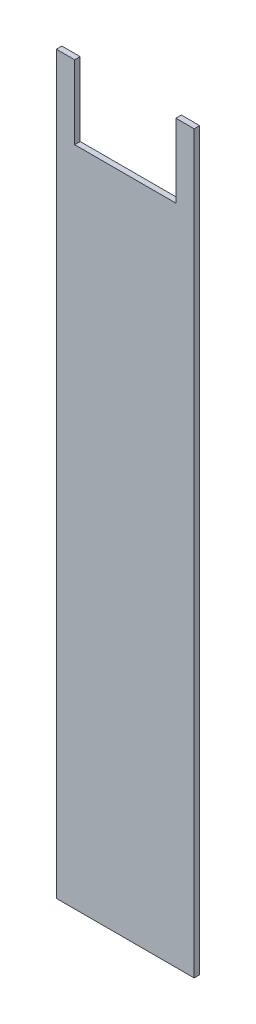
ISO-10303-21;
HEADER;
FILE_DESCRIPTION(('STEP AP214'),'2;1');
FILE_NAME('part.step','',(''),(''),'','','');
FILE_SCHEMA(('AUTOMOTIVE_DESIGN { 1 0 10303 214 1 1 1 1 }'));
ENDSEC;
DATA;
#1=APPLICATION_CONTEXT('core data for automotive mechanical design processes');
#2=APPLICATION_PROTOCOL_DEFINITION('international standard','automotive_design',2000,#1);
#3=PRODUCT_CONTEXT('',#1,'mechanical');
#4=PRODUCT('Part','Part','',(#3));
#5=PRODUCT_RELATED_PRODUCT_CATEGORY('part','',(#4));
#6=PRODUCT_DEFINITION_FORMATION('','',#4);
#7=PRODUCT_DEFINITION_CONTEXT('part definition',#1,'design');
#8=PRODUCT_DEFINITION('design','',#6,#7);
#9=PRODUCT_DEFINITION_SHAPE('','',#8);
#10=(LENGTH_UNIT() NAMED_UNIT(*) SI_UNIT(.MILLI.,.METRE.));
#11=(NAMED_UNIT(*) PLANE_ANGLE_UNIT() SI_UNIT($,.RADIAN.));
#12=(NAMED_UNIT(*) SI_UNIT($,.STERADIAN.) SOLID_ANGLE_UNIT());
#13=UNCERTAINTY_MEASURE_WITH_UNIT(LENGTH_MEASURE(1.E-05),#10,'distance_accuracy_value','');
#14=(GEOMETRIC_REPRESENTATION_CONTEXT(3) GLOBAL_UNCERTAINTY_ASSIGNED_CONTEXT((#13)) GLOBAL_UNIT_ASSIGNED_CONTEXT((#10,
#11,#12)) REPRESENTATION_CONTEXT('',''));
#15=CARTESIAN_POINT('',(0.,0.,0.));
#16=DIRECTION('',(0.,0.,1.));
#17=DIRECTION('',(1.,0.,0.));
#18=AXIS2_PLACEMENT_3D('',#15,#16,#17);
#19=CARTESIAN_POINT('',(75.,0.,3.));
#20=DIRECTION('',(0.,1.,0.));
#21=DIRECTION('',(-1.,0.,0.));
#22=AXIS2_PLACEMENT_3D('',#19,#20,#21);
#23=PLANE('',#22);
#24=DIRECTION('',(1.,0.,0.));
#25=VECTOR('',#24,1.);
#26=CARTESIAN_POINT('',(75.,0.,0.));
#27=LINE('',#26,#25);
#28=CARTESIAN_POINT('',(0.,0.,0.));
#29=VERTEX_POINT('',#28);
#30=CARTESIAN_POINT('',(75.,0.,0.));
#31=VERTEX_POINT('',#30);
#32=EDGE_CURVE('E129',#29,#31,#27,.T.);
#33=ORIENTED_EDGE('',*,*,#32,.T.);
#34=DIRECTION('',(0.,0.,-1.));
#35=VECTOR('',#34,1.);
#36=CARTESIAN_POINT('',(75.,0.,3.));
#37=LINE('',#36,#35);
#38=CARTESIAN_POINT('',(75.,0.,3.));
#39=VERTEX_POINT('',#38);
#40=EDGE_CURVE('E11',#39,#31,#37,.T.);
#41=ORIENTED_EDGE('',*,*,#40,.F.);
#42=DIRECTION('',(1.,0.,0.));
#43=VECTOR('',#42,1.);
#44=CARTESIAN_POINT('',(75.,0.,3.));
#45=LINE('',#44,#43);
#46=CARTESIAN_POINT('',(0.,0.,3.));
#47=VERTEX_POINT('',#46);
#48=EDGE_CURVE('E143',#47,#39,#45,.T.);
#49=ORIENTED_EDGE('',*,*,#48,.F.);
#50=DIRECTION('',(0.,0.,-1.));
#51=VECTOR('',#50,1.);
#52=CARTESIAN_POINT('',(0.,0.,3.));
#53=LINE('',#52,#51);
#54=EDGE_CURVE('E125',#47,#29,#53,.T.);
#55=ORIENTED_EDGE('',*,*,#54,.T.);
#56=EDGE_LOOP('',(#33,#41,#49,#55));
#57=FACE_BOUND('',#56,.T.);
#58=ADVANCED_FACE('F33',(#57),#23,.F.);
#59=CARTESIAN_POINT('',(75.,400.,3.));
#60=DIRECTION('',(-1.,0.,0.));
#61=DIRECTION('',(0.,-1.,0.));
#62=AXIS2_PLACEMENT_3D('',#59,#60,#61);
#63=PLANE('',#62);
#64=DIRECTION('',(0.,1.,0.));
#65=VECTOR('',#64,1.);
#66=CARTESIAN_POINT('',(75.,400.,0.));
#67=LINE('',#66,#65);
#68=CARTESIAN_POINT('',(75.,400.,0.));
#69=VERTEX_POINT('',#68);
#70=EDGE_CURVE('E132',#31,#69,#67,.T.);
#71=ORIENTED_EDGE('',*,*,#70,.T.);
#72=DIRECTION('',(0.,0.,-1.));
#73=VECTOR('',#72,1.);
#74=CARTESIAN_POINT('',(75.,400.,3.));
#75=LINE('',#74,#73);
#76=CARTESIAN_POINT('',(75.,400.,3.));
#77=VERTEX_POINT('',#76);
#78=EDGE_CURVE('E41',#77,#69,#75,.T.);
#79=ORIENTED_EDGE('',*,*,#78,.F.);
#80=DIRECTION('',(0.,1.,0.));
#81=VECTOR('',#80,1.);
#82=CARTESIAN_POINT('',(75.,400.,3.));
#83=LINE('',#82,#81);
#84=EDGE_CURVE('E92',#39,#77,#83,.T.);
#85=ORIENTED_EDGE('',*,*,#84,.F.);
#86=ORIENTED_EDGE('',*,*,#40,.T.);
#87=EDGE_LOOP('',(#71,#79,#85,#86));
#88=FACE_BOUND('',#87,.T.);
#89=ADVANCED_FACE('F178',(#88),#63,.F.);
#90=CARTESIAN_POINT('',(65.,400.,3.));
#91=DIRECTION('',(0.,-1.,0.));
#92=DIRECTION('',(0.,0.,-1.));
#93=AXIS2_PLACEMENT_3D('',#90,#91,#92);
#94=PLANE('',#93);
#95=DIRECTION('',(-1.,0.,0.));
#96=VECTOR('',#95,1.);
#97=CARTESIAN_POINT('',(65.,400.,0.));
#98=LINE('',#97,#96);
#99=CARTESIAN_POINT('',(65.,400.,0.));
#100=VERTEX_POINT('',#99);
#101=EDGE_CURVE('E134',#69,#100,#98,.T.);
#102=ORIENTED_EDGE('',*,*,#101,.T.);
#103=DIRECTION('',(0.,0.,-1.));
#104=VECTOR('',#103,1.);
#105=CARTESIAN_POINT('',(65.,400.,3.));
#106=LINE('',#105,#104);
#107=CARTESIAN_POINT('',(65.,400.,3.));
#108=VERTEX_POINT('',#107);
#109=EDGE_CURVE('E150',#108,#100,#106,.T.);
#110=ORIENTED_EDGE('',*,*,#109,.F.);
#111=DIRECTION('',(-1.,0.,0.));
#112=VECTOR('',#111,1.);
#113=CARTESIAN_POINT('',(65.,400.,3.));
#114=LINE('',#113,#112);
#115=EDGE_CURVE('E158',#77,#108,#114,.T.);
#116=ORIENTED_EDGE('',*,*,#115,.F.);
#117=ORIENTED_EDGE('',*,*,#78,.T.);
#118=EDGE_LOOP('',(#102,#110,#116,#117));
#119=FACE_BOUND('',#118,.T.);
#120=ADVANCED_FACE('F156',(#119),#94,.F.);
#121=CARTESIAN_POINT('',(65.,360.,3.));
#122=DIRECTION('',(1.,0.,0.));
#123=DIRECTION('',(0.,0.,-1.));
#124=AXIS2_PLACEMENT_3D('',#121,#122,#123);
#125=PLANE('',#124);
#126=DIRECTION('',(0.,-1.,0.));
#127=VECTOR('',#126,1.);
#128=CARTESIAN_POINT('',(65.,360.,0.));
#129=LINE('',#128,#127);
#130=CARTESIAN_POINT('',(65.,360.,0.));
#131=VERTEX_POINT('',#130);
#132=EDGE_CURVE('E136',#100,#131,#129,.T.);
#133=ORIENTED_EDGE('',*,*,#132,.T.);
#134=DIRECTION('',(0.,0.,-1.));
#135=VECTOR('',#134,1.);
#136=CARTESIAN_POINT('',(65.,360.,3.));
#137=LINE('',#136,#135);
#138=CARTESIAN_POINT('',(65.,360.,3.));
#139=VERTEX_POINT('',#138);
#140=EDGE_CURVE('E147',#139,#131,#137,.T.);
#141=ORIENTED_EDGE('',*,*,#140,.F.);
#142=DIRECTION('',(0.,-1.,0.));
#143=VECTOR('',#142,1.);
#144=CARTESIAN_POINT('',(65.,360.,3.));
#145=LINE('',#144,#143);
#146=EDGE_CURVE('E170',#108,#139,#145,.T.);
#147=ORIENTED_EDGE('',*,*,#146,.F.);
#148=ORIENTED_EDGE('',*,*,#109,.T.);
#149=EDGE_LOOP('',(#133,#141,#147,#148));
#150=FACE_BOUND('',#149,.T.);
#151=ADVANCED_FACE('F166',(#150),#125,.F.);
#152=CARTESIAN_POINT('',(10.,360.,3.));
#153=DIRECTION('',(0.,-1.,0.));
#154=DIRECTION('',(0.,0.,-1.));
#155=AXIS2_PLACEMENT_3D('',#152,#153,#154);
#156=PLANE('',#155);
#157=DIRECTION('',(-1.,0.,0.));
#158=VECTOR('',#157,1.);
#159=CARTESIAN_POINT('',(10.,360.,0.));
#160=LINE('',#159,#158);
#161=CARTESIAN_POINT('',(10.,360.,0.));
#162=VERTEX_POINT('',#161);
#163=EDGE_CURVE('E138',#131,#162,#160,.T.);
#164=ORIENTED_EDGE('',*,*,#163,.T.);
#165=DIRECTION('',(0.,0.,-1.));
#166=VECTOR('',#165,1.);
#167=CARTESIAN_POINT('',(10.,360.,3.));
#168=LINE('',#167,#166);
#169=CARTESIAN_POINT('',(10.,360.,3.));
#170=VERTEX_POINT('',#169);
#171=EDGE_CURVE('E120',#170,#162,#168,.T.);
#172=ORIENTED_EDGE('',*,*,#171,.F.);
#173=DIRECTION('',(-1.,0.,0.));
#174=VECTOR('',#173,1.);
#175=CARTESIAN_POINT('',(10.,360.,3.));
#176=LINE('',#175,#174);
#177=EDGE_CURVE('E111',#139,#170,#176,.T.);
#178=ORIENTED_EDGE('',*,*,#177,.F.);
#179=ORIENTED_EDGE('',*,*,#140,.T.);
#180=EDGE_LOOP('',(#164,#172,#178,#179));
#181=FACE_BOUND('',#180,.T.);
#182=ADVANCED_FACE('F169',(#181),#156,.F.);
#183=CARTESIAN_POINT('',(9.99999999999999,400.,3.));
#184=DIRECTION('',(-1.,0.,0.));
#185=DIRECTION('',(0.,-1.,0.));
#186=AXIS2_PLACEMENT_3D('',#183,#184,#185);
#187=PLANE('',#186);
#188=DIRECTION('',(0.,1.,0.));
#189=VECTOR('',#188,1.);
#190=CARTESIAN_POINT('',(9.99999999999999,400.,0.));
#191=LINE('',#190,#189);
#192=CARTESIAN_POINT('',(9.99999999999999,400.,0.));
#193=VERTEX_POINT('',#192);
#194=EDGE_CURVE('E119',#162,#193,#191,.T.);
#195=ORIENTED_EDGE('',*,*,#194,.T.);
#196=DIRECTION('',(0.,0.,-1.));
#197=VECTOR('',#196,1.);
#198=CARTESIAN_POINT('',(9.99999999999999,400.,3.));
#199=LINE('',#198,#197);
#200=CARTESIAN_POINT('',(9.99999999999999,400.,3.));
#201=VERTEX_POINT('',#200);
#202=EDGE_CURVE('E116',#201,#193,#199,.T.);
#203=ORIENTED_EDGE('',*,*,#202,.F.);
#204=DIRECTION('',(0.,1.,0.));
#205=VECTOR('',#204,1.);
#206=CARTESIAN_POINT('',(9.99999999999999,400.,3.));
#207=LINE('',#206,#205);
#208=EDGE_CURVE('E105',#170,#201,#207,.T.);
#209=ORIENTED_EDGE('',*,*,#208,.F.);
#210=ORIENTED_EDGE('',*,*,#171,.T.);
#211=EDGE_LOOP('',(#195,#203,#209,#210));
#212=FACE_BOUND('',#211,.T.);
#213=ADVANCED_FACE('F117',(#212),#187,.F.);
#214=CARTESIAN_POINT('',(0.,400.,3.));
#215=DIRECTION('',(0.,-1.,0.));
#216=DIRECTION('',(0.,0.,-1.));
#217=AXIS2_PLACEMENT_3D('',#214,#215,#216);
#218=PLANE('',#217);
#219=DIRECTION('',(-1.,0.,0.));
#220=VECTOR('',#219,1.);
#221=CARTESIAN_POINT('',(0.,400.,0.));
#222=LINE('',#221,#220);
#223=CARTESIAN_POINT('',(0.,400.,0.));
#224=VERTEX_POINT('',#223);
#225=EDGE_CURVE('E78',#193,#224,#222,.T.);
#226=ORIENTED_EDGE('',*,*,#225,.T.);
#227=DIRECTION('',(0.,0.,-1.));
#228=VECTOR('',#227,1.);
#229=CARTESIAN_POINT('',(0.,400.,3.));
#230=LINE('',#229,#228);
#231=CARTESIAN_POINT('',(0.,400.,3.));
#232=VERTEX_POINT('',#231);
#233=EDGE_CURVE('E121',#232,#224,#230,.T.);
#234=ORIENTED_EDGE('',*,*,#233,.F.);
#235=DIRECTION('',(-1.,0.,0.));
#236=VECTOR('',#235,1.);
#237=CARTESIAN_POINT('',(0.,400.,3.));
#238=LINE('',#237,#236);
#239=EDGE_CURVE('E109',#201,#232,#238,.T.);
#240=ORIENTED_EDGE('',*,*,#239,.F.);
#241=ORIENTED_EDGE('',*,*,#202,.T.);
#242=EDGE_LOOP('',(#226,#234,#240,#241));
#243=FACE_BOUND('',#242,.T.);
#244=ADVANCED_FACE('F123',(#243),#218,.F.);
#245=CARTESIAN_POINT('',(0.,0.,3.));
#246=DIRECTION('',(1.,0.,0.));
#247=DIRECTION('',(0.,0.,-1.));
#248=AXIS2_PLACEMENT_3D('',#245,#246,#247);
#249=PLANE('',#248);
#250=DIRECTION('',(0.,-1.,0.));
#251=VECTOR('',#250,1.);
#252=CARTESIAN_POINT('',(0.,0.,0.));
#253=LINE('',#252,#251);
#254=EDGE_CURVE('E84',#224,#29,#253,.T.);
#255=ORIENTED_EDGE('',*,*,#254,.T.);
#256=ORIENTED_EDGE('',*,*,#54,.F.);
#257=DIRECTION('',(0.,-1.,0.));
#258=VECTOR('',#257,1.);
#259=CARTESIAN_POINT('',(0.,0.,3.));
#260=LINE('',#259,#258);
#261=EDGE_CURVE('E49',#232,#47,#260,.T.);
#262=ORIENTED_EDGE('',*,*,#261,.F.);
#263=ORIENTED_EDGE('',*,*,#233,.T.);
#264=EDGE_LOOP('',(#255,#256,#262,#263));
#265=FACE_BOUND('',#264,.T.);
#266=ADVANCED_FACE('F194',(#265),#249,.F.);
#267=CARTESIAN_POINT('',(0.,0.,3.));
#268=DIRECTION('',(0.,0.,-1.));
#269=DIRECTION('',(-1.,0.,0.));
#270=AXIS2_PLACEMENT_3D('',#267,#268,#269);
#271=PLANE('',#270);
#272=ORIENTED_EDGE('',*,*,#48,.T.);
#273=ORIENTED_EDGE('',*,*,#84,.T.);
#274=ORIENTED_EDGE('',*,*,#115,.T.);
#275=ORIENTED_EDGE('',*,*,#146,.T.);
#276=ORIENTED_EDGE('',*,*,#177,.T.);
#277=ORIENTED_EDGE('',*,*,#208,.T.);
#278=ORIENTED_EDGE('',*,*,#239,.T.);
#279=ORIENTED_EDGE('',*,*,#261,.T.);
#280=EDGE_LOOP('',(#272,#273,#274,#275,#276,#277,#278,#279));
#281=FACE_BOUND('',#280,.T.);
#282=ADVANCED_FACE('F107',(#281),#271,.F.);
#283=CARTESIAN_POINT('',(0.,0.,0.));
#284=DIRECTION('',(0.,0.,-1.));
#285=DIRECTION('',(-1.,0.,0.));
#286=AXIS2_PLACEMENT_3D('',#283,#284,#285);
#287=PLANE('',#286);
#288=ORIENTED_EDGE('',*,*,#32,.F.);
#289=ORIENTED_EDGE('',*,*,#254,.F.);
#290=ORIENTED_EDGE('',*,*,#225,.F.);
#291=ORIENTED_EDGE('',*,*,#194,.F.);
#292=ORIENTED_EDGE('',*,*,#163,.F.);
#293=ORIENTED_EDGE('',*,*,#132,.F.);
#294=ORIENTED_EDGE('',*,*,#101,.F.);
#295=ORIENTED_EDGE('',*,*,#70,.F.);
#296=EDGE_LOOP('',(#288,#289,#290,#291,#292,#293,#294,#295));
#297=FACE_BOUND('',#296,.T.);
#298=ADVANCED_FACE('F162',(#297),#287,.T.);
#299=CLOSED_SHELL('',(#58,#89,#120,#151,#182,#213,#244,#266,#282,#298));
#300=MANIFOLD_SOLID_BREP('B2',#299);
#301=ADVANCED_BREP_SHAPE_REPRESENTATION('',(#18,#300),#14);
#302=SHAPE_DEFINITION_REPRESENTATION(#9,#301);
ENDSEC;
END-ISO-10303-21;
